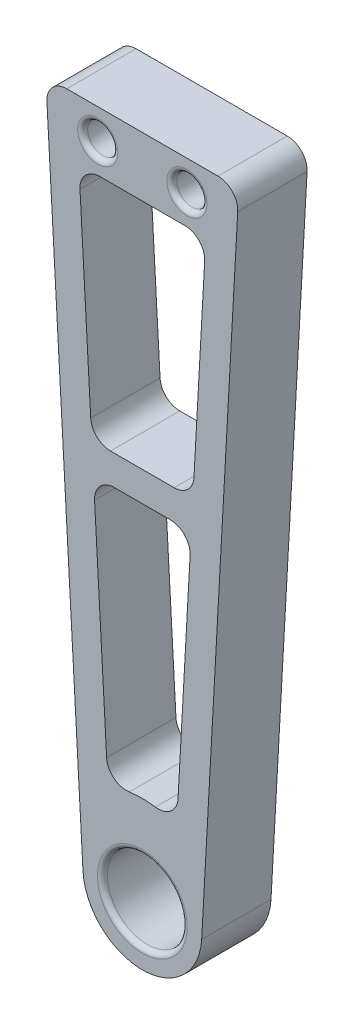
ISO-10303-21;
HEADER;
FILE_DESCRIPTION(('STEP AP214'),'2;1');
FILE_NAME('part.step','',(''),(''),'','','');
FILE_SCHEMA(('AUTOMOTIVE_DESIGN { 1 0 10303 214 1 1 1 1 }'));
ENDSEC;
DATA;
#1=APPLICATION_CONTEXT('core data for automotive mechanical design processes');
#2=APPLICATION_PROTOCOL_DEFINITION('international standard','automotive_design',2000,#1);
#3=PRODUCT_CONTEXT('',#1,'mechanical');
#4=PRODUCT('Part','Part','',(#3));
#5=PRODUCT_RELATED_PRODUCT_CATEGORY('part','',(#4));
#6=PRODUCT_DEFINITION_FORMATION('','',#4);
#7=PRODUCT_DEFINITION_CONTEXT('part definition',#1,'design');
#8=PRODUCT_DEFINITION('design','',#6,#7);
#9=PRODUCT_DEFINITION_SHAPE('','',#8);
#10=(LENGTH_UNIT() NAMED_UNIT(*) SI_UNIT(.MILLI.,.METRE.));
#11=(NAMED_UNIT(*) PLANE_ANGLE_UNIT() SI_UNIT($,.RADIAN.));
#12=(NAMED_UNIT(*) SI_UNIT($,.STERADIAN.) SOLID_ANGLE_UNIT());
#13=UNCERTAINTY_MEASURE_WITH_UNIT(LENGTH_MEASURE(1.E-05),#10,'distance_accuracy_value','');
#14=(GEOMETRIC_REPRESENTATION_CONTEXT(3) GLOBAL_UNCERTAINTY_ASSIGNED_CONTEXT((#13)) GLOBAL_UNIT_ASSIGNED_CONTEXT((#10,
#11,#12)) REPRESENTATION_CONTEXT('',''));
#15=CARTESIAN_POINT('',(0.,0.,0.));
#16=DIRECTION('',(0.,0.,1.));
#17=DIRECTION('',(1.,0.,0.));
#18=AXIS2_PLACEMENT_3D('',#15,#16,#17);
#19=CARTESIAN_POINT('',(7.98764478027175,-0.444444444444444,7.));
#20=DIRECTION('',(0.998455597533968,-0.0555555555555555,0.));
#21=DIRECTION('',(0.0555555555555555,0.998455597533968,0.));
#22=AXIS2_PLACEMENT_3D('',#19,#20,#21);
#23=PLANE('',#22);
#24=DIRECTION('',(-0.0555555555555555,-0.998455597533968,0.));
#25=VECTOR('',#24,1.);
#26=CARTESIAN_POINT('',(7.98764478027175,-0.444444444444444,0.));
#27=LINE('',#26,#25);
#28=CARTESIAN_POINT('',(6.29384167167906,-30.885813952551,0.));
#29=VERTEX_POINT('',#28);
#30=CARTESIAN_POINT('',(5.21106422918038,-50.3457075227848,0.));
#31=VERTEX_POINT('',#30);
#32=EDGE_CURVE('E519',#29,#31,#27,.T.);
#33=ORIENTED_EDGE('',*,*,#32,.T.);
#34=DIRECTION('',(0.,0.,1.));
#35=VECTOR('',#34,1.);
#36=CARTESIAN_POINT('',(5.21106422918038,-50.3457075227848,7.));
#37=LINE('',#36,#35);
#38=CARTESIAN_POINT('',(5.21106422918038,-50.3457075227848,7.));
#39=VERTEX_POINT('',#38);
#40=EDGE_CURVE('E260',#31,#39,#37,.T.);
#41=ORIENTED_EDGE('',*,*,#40,.T.);
#42=DIRECTION('',(-0.0555555555555555,-0.998455597533968,0.));
#43=VECTOR('',#42,1.);
#44=CARTESIAN_POINT('',(7.98764478027175,-0.444444444444444,7.));
#45=LINE('',#44,#43);
#46=CARTESIAN_POINT('',(6.29384167167906,-30.885813952551,7.));
#47=VERTEX_POINT('',#46);
#48=EDGE_CURVE('E456',#47,#39,#45,.T.);
#49=ORIENTED_EDGE('',*,*,#48,.F.);
#50=DIRECTION('',(0.,0.,1.));
#51=VECTOR('',#50,1.);
#52=CARTESIAN_POINT('',(6.29384167167906,-30.885813952551,7.));
#53=LINE('',#52,#51);
#54=EDGE_CURVE('E257',#47,#29,#53,.F.);
#55=ORIENTED_EDGE('',*,*,#54,.T.);
#56=EDGE_LOOP('',(#33,#41,#49,#55));
#57=FACE_BOUND('',#56,.T.);
#58=ADVANCED_FACE('F44',(#57),#23,.F.);
#59=CARTESIAN_POINT('',(-7.98764478027175,-0.444444444444445,7.));
#60=DIRECTION('',(0.998455597533968,0.0555555555555557,0.));
#61=DIRECTION('',(-0.0555555555555557,0.998455597533968,0.));
#62=AXIS2_PLACEMENT_3D('',#59,#60,#61);
#63=PLANE('',#62);
#64=DIRECTION('',(0.0555555555555557,-0.998455597533968,0.));
#65=VECTOR('',#64,1.);
#66=CARTESIAN_POINT('',(-7.98764478027175,-0.444444444444445,7.));
#67=LINE('',#66,#65);
#68=CARTESIAN_POINT('',(-6.29384167167905,-30.885813952551,7.));
#69=VERTEX_POINT('',#68);
#70=CARTESIAN_POINT('',(-5.21106422918037,-50.3457075227848,7.));
#71=VERTEX_POINT('',#70);
#72=EDGE_CURVE('E236',#69,#71,#67,.T.);
#73=ORIENTED_EDGE('',*,*,#72,.T.);
#74=DIRECTION('',(0.,0.,1.));
#75=VECTOR('',#74,1.);
#76=CARTESIAN_POINT('',(-5.21106422918037,-50.3457075227848,0.));
#77=LINE('',#76,#75);
#78=CARTESIAN_POINT('',(-5.21106422918037,-50.3457075227848,0.));
#79=VERTEX_POINT('',#78);
#80=EDGE_CURVE('E275',#71,#79,#77,.F.);
#81=ORIENTED_EDGE('',*,*,#80,.T.);
#82=DIRECTION('',(0.0555555555555557,-0.998455597533968,0.));
#83=VECTOR('',#82,1.);
#84=CARTESIAN_POINT('',(-7.98764478027175,-0.444444444444445,0.));
#85=LINE('',#84,#83);
#86=CARTESIAN_POINT('',(-6.29384167167905,-30.885813952551,0.));
#87=VERTEX_POINT('',#86);
#88=EDGE_CURVE('E210',#87,#79,#85,.T.);
#89=ORIENTED_EDGE('',*,*,#88,.F.);
#90=DIRECTION('',(0.,0.,1.));
#91=VECTOR('',#90,1.);
#92=CARTESIAN_POINT('',(-6.29384167167905,-30.885813952551,7.));
#93=LINE('',#92,#91);
#94=EDGE_CURVE('E271',#87,#69,#93,.T.);
#95=ORIENTED_EDGE('',*,*,#94,.T.);
#96=EDGE_LOOP('',(#73,#81,#89,#95));
#97=FACE_BOUND('',#96,.T.);
#98=ADVANCED_FACE('F428',(#97),#63,.T.);
#99=CARTESIAN_POINT('',(4.82157381032812,-57.3457075227848,7.));
#100=VERTEX_POINT('',#99);
#101=CARTESIAN_POINT('',(3.6039474120521,-79.2291335979336,7.));
#102=VERTEX_POINT('',#101);
#103=EDGE_CURVE('E448',#100,#102,#45,.T.);
#104=ORIENTED_EDGE('',*,*,#103,.F.);
#105=DIRECTION('',(0.,0.,1.));
#106=VECTOR('',#105,1.);
#107=CARTESIAN_POINT('',(4.82157381032812,-57.3457075227848,7.));
#108=LINE('',#107,#106);
#109=CARTESIAN_POINT('',(4.82157381032812,-57.3457075227848,0.));
#110=VERTEX_POINT('',#109);
#111=EDGE_CURVE('E246',#100,#110,#108,.F.);
#112=ORIENTED_EDGE('',*,*,#111,.T.);
#113=CARTESIAN_POINT('',(3.6039474120521,-79.2291335979336,0.));
#114=VERTEX_POINT('',#113);
#115=EDGE_CURVE('E469',#110,#114,#27,.T.);
#116=ORIENTED_EDGE('',*,*,#115,.T.);
#117=DIRECTION('',(0.,0.,1.));
#118=VECTOR('',#117,1.);
#119=CARTESIAN_POINT('',(3.6039474120521,-79.2291335979336,7.));
#120=LINE('',#119,#118);
#121=EDGE_CURVE('E243',#114,#102,#120,.T.);
#122=ORIENTED_EDGE('',*,*,#121,.T.);
#123=EDGE_LOOP('',(#104,#112,#116,#122));
#124=FACE_BOUND('',#123,.T.);
#125=ADVANCED_FACE('F431',(#124),#23,.F.);
#126=CARTESIAN_POINT('',(-4.82157381032811,-57.3457075227848,0.));
#127=VERTEX_POINT('',#126);
#128=CARTESIAN_POINT('',(-3.60394741205208,-79.2291335979336,0.));
#129=VERTEX_POINT('',#128);
#130=EDGE_CURVE('E525',#127,#129,#85,.T.);
#131=ORIENTED_EDGE('',*,*,#130,.F.);
#132=DIRECTION('',(0.,0.,1.));
#133=VECTOR('',#132,1.);
#134=CARTESIAN_POINT('',(-4.82157381032811,-57.3457075227848,7.));
#135=LINE('',#134,#133);
#136=CARTESIAN_POINT('',(-4.82157381032811,-57.3457075227848,7.));
#137=VERTEX_POINT('',#136);
#138=EDGE_CURVE('E253',#127,#137,#135,.T.);
#139=ORIENTED_EDGE('',*,*,#138,.T.);
#140=CARTESIAN_POINT('',(-3.60394741205208,-79.2291335979336,7.));
#141=VERTEX_POINT('',#140);
#142=EDGE_CURVE('E508',#137,#141,#67,.T.);
#143=ORIENTED_EDGE('',*,*,#142,.T.);
#144=DIRECTION('',(0.,0.,-1.));
#145=VECTOR('',#144,1.);
#146=CARTESIAN_POINT('',(-3.60394741205208,-79.2291335979336,7.));
#147=LINE('',#146,#145);
#148=EDGE_CURVE('E249',#141,#129,#147,.T.);
#149=ORIENTED_EDGE('',*,*,#148,.T.);
#150=EDGE_LOOP('',(#131,#139,#143,#149));
#151=FACE_BOUND('',#150,.T.);
#152=ADVANCED_FACE('F436',(#151),#63,.T.);
#153=CARTESIAN_POINT('',(0.,-90.,7.));
#154=DIRECTION('',(0.,0.,-1.));
#155=DIRECTION('',(-1.,0.,0.));
#156=AXIS2_PLACEMENT_3D('',#153,#154,#155);
#157=CYLINDRICAL_SURFACE('',#156,9.00000000000001);
#158=CARTESIAN_POINT('',(0.,-90.,0.));
#159=DIRECTION('',(0.,0.,1.));
#160=DIRECTION('',(1.,0.,0.));
#161=AXIS2_PLACEMENT_3D('',#158,#159,#160);
#162=CIRCLE('',#161,9.00000000000001);
#163=CARTESIAN_POINT('',(1.31484781389614,-81.0965638528547,0.));
#164=VERTEX_POINT('',#163);
#165=CARTESIAN_POINT('',(-1.31484781389612,-81.0965638528547,0.));
#166=VERTEX_POINT('',#165);
#167=EDGE_CURVE('E522',#164,#166,#162,.T.);
#168=ORIENTED_EDGE('',*,*,#167,.T.);
#169=DIRECTION('',(0.,0.,-1.));
#170=VECTOR('',#169,1.);
#171=CARTESIAN_POINT('',(-1.31484781389612,-81.0965638528547,7.));
#172=LINE('',#171,#170);
#173=CARTESIAN_POINT('',(-1.31484781389612,-81.0965638528547,7.));
#174=VERTEX_POINT('',#173);
#175=EDGE_CURVE('E311',#166,#174,#172,.F.);
#176=ORIENTED_EDGE('',*,*,#175,.T.);
#177=CARTESIAN_POINT('',(0.,-90.,7.));
#178=DIRECTION('',(0.,0.,1.));
#179=DIRECTION('',(1.,0.,0.));
#180=AXIS2_PLACEMENT_3D('',#177,#178,#179);
#181=CIRCLE('',#180,9.00000000000001);
#182=CARTESIAN_POINT('',(1.31484781389614,-81.0965638528547,7.));
#183=VERTEX_POINT('',#182);
#184=EDGE_CURVE('E504',#183,#174,#181,.T.);
#185=ORIENTED_EDGE('',*,*,#184,.F.);
#186=DIRECTION('',(0.,0.,-1.));
#187=VECTOR('',#186,1.);
#188=CARTESIAN_POINT('',(1.31484781389614,-81.0965638528547,7.));
#189=LINE('',#188,#187);
#190=EDGE_CURVE('E307',#183,#164,#189,.T.);
#191=ORIENTED_EDGE('',*,*,#190,.T.);
#192=EDGE_LOOP('',(#168,#176,#185,#191));
#193=FACE_BOUND('',#192,.T.);
#194=ADVANCED_FACE('F444',(#193),#157,.T.);
#195=CARTESIAN_POINT('',(-10.9830115728737,-0.611111111111113,7.));
#196=DIRECTION('',(0.998455597533968,0.0555555555555557,0.));
#197=DIRECTION('',(-0.0555555555555557,0.998455597533968,0.));
#198=AXIS2_PLACEMENT_3D('',#195,#196,#197);
#199=PLANE('',#198);
#200=DIRECTION('',(0.0555555555555557,-0.998455597533968,0.));
#201=VECTOR('',#200,1.);
#202=CARTESIAN_POINT('',(-10.9830115728737,-0.611111111111113,7.));
#203=LINE('',#202,#201);
#204=CARTESIAN_POINT('',(-9.632330976127,-24.885813952551,7.));
#205=VERTEX_POINT('',#204);
#206=CARTESIAN_POINT('',(-5.9907335852038,-90.3333333333333,7.));
#207=VERTEX_POINT('',#206);
#208=EDGE_CURVE('E196',#205,#207,#203,.T.);
#209=ORIENTED_EDGE('',*,*,#208,.F.);
#210=DIRECTION('',(0.,0.,-1.));
#211=VECTOR('',#210,1.);
#212=CARTESIAN_POINT('',(-9.632330976127,-24.885813952551,0.));
#213=LINE('',#212,#211);
#214=CARTESIAN_POINT('',(-9.632330976127,-24.885813952551,0.));
#215=VERTEX_POINT('',#214);
#216=EDGE_CURVE('E298',#205,#215,#213,.T.);
#217=ORIENTED_EDGE('',*,*,#216,.T.);
#218=DIRECTION('',(0.0555555555555557,-0.998455597533968,0.));
#219=VECTOR('',#218,1.);
#220=CARTESIAN_POINT('',(-10.9830115728737,-0.611111111111113,0.));
#221=LINE('',#220,#219);
#222=CARTESIAN_POINT('',(-5.9907335852038,-90.3333333333333,0.));
#223=VERTEX_POINT('',#222);
#224=EDGE_CURVE('E224',#215,#223,#221,.T.);
#225=ORIENTED_EDGE('',*,*,#224,.T.);
#226=DIRECTION('',(0.,0.,-1.));
#227=VECTOR('',#226,1.);
#228=CARTESIAN_POINT('',(-5.9907335852038,-90.3333333333333,7.));
#229=LINE('',#228,#227);
#230=EDGE_CURVE('E216',#207,#223,#229,.T.);
#231=ORIENTED_EDGE('',*,*,#230,.F.);
#232=EDGE_LOOP('',(#209,#217,#225,#231));
#233=FACE_BOUND('',#232,.T.);
#234=ADVANCED_FACE('F222',(#233),#199,.F.);
#235=CARTESIAN_POINT('',(0.,-90.,7.));
#236=DIRECTION('',(0.,0.,-1.));
#237=DIRECTION('',(-1.,0.,0.));
#238=AXIS2_PLACEMENT_3D('',#235,#236,#237);
#239=CYLINDRICAL_SURFACE('',#238,6.);
#240=CARTESIAN_POINT('',(0.,-90.,0.));
#241=DIRECTION('',(0.,0.,1.));
#242=DIRECTION('',(1.,0.,0.));
#243=AXIS2_PLACEMENT_3D('',#240,#241,#242);
#244=CIRCLE('',#243,6.);
#245=CARTESIAN_POINT('',(5.99073358520382,-90.3333333333333,0.));
#246=VERTEX_POINT('',#245);
#247=EDGE_CURVE('E513',#223,#246,#244,.T.);
#248=ORIENTED_EDGE('',*,*,#247,.T.);
#249=DIRECTION('',(0.,0.,-1.));
#250=VECTOR('',#249,1.);
#251=CARTESIAN_POINT('',(5.99073358520382,-90.3333333333333,7.));
#252=LINE('',#251,#250);
#253=CARTESIAN_POINT('',(5.99073358520382,-90.3333333333333,7.));
#254=VERTEX_POINT('',#253);
#255=EDGE_CURVE('E218',#254,#246,#252,.T.);
#256=ORIENTED_EDGE('',*,*,#255,.F.);
#257=CARTESIAN_POINT('',(0.,-90.,7.));
#258=DIRECTION('',(0.,0.,1.));
#259=DIRECTION('',(1.,0.,0.));
#260=AXIS2_PLACEMENT_3D('',#257,#258,#259);
#261=CIRCLE('',#260,6.);
#262=EDGE_CURVE('E200',#207,#254,#261,.T.);
#263=ORIENTED_EDGE('',*,*,#262,.F.);
#264=ORIENTED_EDGE('',*,*,#230,.T.);
#265=EDGE_LOOP('',(#248,#256,#263,#264));
#266=FACE_BOUND('',#265,.T.);
#267=ADVANCED_FACE('F215',(#266),#239,.T.);
#268=CARTESIAN_POINT('',(10.9830115728737,-0.61111111111111,7.));
#269=DIRECTION('',(0.998455597533968,-0.0555555555555555,0.));
#270=DIRECTION('',(0.0555555555555555,0.998455597533968,0.));
#271=AXIS2_PLACEMENT_3D('',#268,#269,#270);
#272=PLANE('',#271);
#273=DIRECTION('',(-0.0555555555555555,-0.998455597533968,0.));
#274=VECTOR('',#273,1.);
#275=CARTESIAN_POINT('',(10.9830115728737,-0.61111111111111,0.));
#276=LINE('',#275,#274);
#277=CARTESIAN_POINT('',(9.632330976127,-24.885813952551,0.));
#278=VERTEX_POINT('',#277);
#279=EDGE_CURVE('E516',#278,#246,#276,.T.);
#280=ORIENTED_EDGE('',*,*,#279,.F.);
#281=DIRECTION('',(0.,0.,-1.));
#282=VECTOR('',#281,1.);
#283=CARTESIAN_POINT('',(9.632330976127,-24.885813952551,7.));
#284=LINE('',#283,#282);
#285=CARTESIAN_POINT('',(9.632330976127,-24.885813952551,7.));
#286=VERTEX_POINT('',#285);
#287=EDGE_CURVE('E291',#278,#286,#284,.F.);
#288=ORIENTED_EDGE('',*,*,#287,.T.);
#289=DIRECTION('',(-0.0555555555555555,-0.998455597533968,0.));
#290=VECTOR('',#289,1.);
#291=CARTESIAN_POINT('',(10.9830115728737,-0.61111111111111,7.));
#292=LINE('',#291,#290);
#293=EDGE_CURVE('E220',#286,#254,#292,.T.);
#294=ORIENTED_EDGE('',*,*,#293,.T.);
#295=ORIENTED_EDGE('',*,*,#255,.T.);
#296=EDGE_LOOP('',(#280,#288,#294,#295));
#297=FACE_BOUND('',#296,.T.);
#298=ADVANCED_FACE('F628',(#297),#272,.T.);
#299=CARTESIAN_POINT('',(0.,-90.,7.));
#300=DIRECTION('',(0.,0.,-1.));
#301=DIRECTION('',(-1.,0.,0.));
#302=AXIS2_PLACEMENT_3D('',#299,#300,#301);
#303=CYLINDRICAL_SURFACE('',#302,4.025);
#304=CARTESIAN_POINT('',(0.,-90.,0.5));
#305=DIRECTION('',(0.,0.,1.));
#306=DIRECTION('',(1.,0.,0.));
#307=AXIS2_PLACEMENT_3D('',#304,#305,#306);
#308=CIRCLE('',#307,4.025);
#309=CARTESIAN_POINT('',(4.02500000000001,-90.,0.5));
#310=VERTEX_POINT('',#309);
#311=EDGE_CURVE('E376',#310,#310,#308,.F.);
#312=ORIENTED_EDGE('',*,*,#311,.T.);
#313=EDGE_LOOP('',(#312));
#314=FACE_BOUND('',#313,.T.);
#315=CARTESIAN_POINT('',(0.,-90.,6.5));
#316=DIRECTION('',(0.,0.,1.));
#317=DIRECTION('',(1.,0.,0.));
#318=AXIS2_PLACEMENT_3D('',#315,#316,#317);
#319=CIRCLE('',#318,4.025);
#320=CARTESIAN_POINT('',(4.02500000000001,-90.,6.5));
#321=VERTEX_POINT('',#320);
#322=EDGE_CURVE('E372',#321,#321,#319,.T.);
#323=ORIENTED_EDGE('',*,*,#322,.T.);
#324=EDGE_LOOP('',(#323));
#325=FACE_BOUND('',#324,.T.);
#326=ADVANCED_FACE('F621',(#314,#325),#303,.F.);
#327=CARTESIAN_POINT('',(0.,0.,7.));
#328=DIRECTION('',(0.,0.,1.));
#329=DIRECTION('',(1.,0.,0.));
#330=AXIS2_PLACEMENT_3D('',#327,#328,#329);
#331=PLANE('',#330);
#332=CARTESIAN_POINT('',(4.5,-25.7747028414399,7.));
#333=DIRECTION('',(0.,0.,1.));
#334=DIRECTION('',(1.,0.,0.));
#335=AXIS2_PLACEMENT_3D('',#332,#333,#334);
#336=CIRCLE('',#335,2.025);
#337=CARTESIAN_POINT('',(6.525,-25.7747028414399,7.));
#338=VERTEX_POINT('',#337);
#339=EDGE_CURVE('E11',#338,#338,#336,.F.);
#340=ORIENTED_EDGE('',*,*,#339,.T.);
#341=EDGE_LOOP('',(#340));
#342=FACE_BOUND('',#341,.T.);
#343=CARTESIAN_POINT('',(-4.5,-25.7747028414399,7.));
#344=DIRECTION('',(0.,0.,1.));
#345=DIRECTION('',(1.,0.,0.));
#346=AXIS2_PLACEMENT_3D('',#343,#344,#345);
#347=CIRCLE('',#346,2.025);
#348=CARTESIAN_POINT('',(-2.475,-25.7747028414399,7.));
#349=VERTEX_POINT('',#348);
#350=EDGE_CURVE('E53',#349,#349,#347,.F.);
#351=ORIENTED_EDGE('',*,*,#350,.T.);
#352=EDGE_LOOP('',(#351));
#353=FACE_BOUND('',#352,.T.);
#354=CARTESIAN_POINT('',(0.,-90.,7.));
#355=DIRECTION('',(0.,0.,1.));
#356=DIRECTION('',(1.,0.,0.));
#357=AXIS2_PLACEMENT_3D('',#354,#355,#356);
#358=CIRCLE('',#357,4.525);
#359=CARTESIAN_POINT('',(4.52500000000001,-90.,7.));
#360=VERTEX_POINT('',#359);
#361=EDGE_CURVE('E396',#360,#360,#358,.F.);
#362=ORIENTED_EDGE('',*,*,#361,.T.);
#363=EDGE_LOOP('',(#362));
#364=FACE_BOUND('',#363,.T.);
#365=ORIENTED_EDGE('',*,*,#142,.F.);
#366=CARTESIAN_POINT('',(-2.82466261526017,-57.2345964116737,7.));
#367=DIRECTION('',(0.,0.,1.));
#368=DIRECTION('',(1.,0.,0.));
#369=AXIS2_PLACEMENT_3D('',#366,#367,#368);
#370=CIRCLE('',#369,2.);
#371=CARTESIAN_POINT('',(-2.82466261526017,-55.2345964116737,7.));
#372=VERTEX_POINT('',#371);
#373=EDGE_CURVE('E320',#137,#372,#370,.F.);
#374=ORIENTED_EDGE('',*,*,#373,.T.);
#375=DIRECTION('',(1.,0.,0.));
#376=VECTOR('',#375,1.);
#377=CARTESIAN_POINT('',(-4.93903917474386,-55.2345964116737,7.));
#378=LINE('',#377,#376);
#379=CARTESIAN_POINT('',(2.82466261526018,-55.2345964116737,7.));
#380=VERTEX_POINT('',#379);
#381=EDGE_CURVE('E543',#372,#380,#378,.T.);
#382=ORIENTED_EDGE('',*,*,#381,.T.);
#383=CARTESIAN_POINT('',(2.82466261526019,-57.2345964116737,7.));
#384=DIRECTION('',(0.,0.,1.));
#385=DIRECTION('',(1.,0.,0.));
#386=AXIS2_PLACEMENT_3D('',#383,#384,#385);
#387=CIRCLE('',#386,2.);
#388=EDGE_CURVE('E314',#380,#100,#387,.F.);
#389=ORIENTED_EDGE('',*,*,#388,.T.);
#390=ORIENTED_EDGE('',*,*,#103,.T.);
#391=CARTESIAN_POINT('',(1.60703621698416,-79.1180224868225,7.));
#392=DIRECTION('',(0.,0.,1.));
#393=DIRECTION('',(1.,0.,0.));
#394=AXIS2_PLACEMENT_3D('',#391,#392,#393);
#395=CIRCLE('',#394,2.);
#396=EDGE_CURVE('E357',#102,#183,#395,.F.);
#397=ORIENTED_EDGE('',*,*,#396,.T.);
#398=ORIENTED_EDGE('',*,*,#184,.T.);
#399=CARTESIAN_POINT('',(-1.60703621698414,-79.1180224868225,7.));
#400=DIRECTION('',(0.,0.,1.));
#401=DIRECTION('',(1.,0.,0.));
#402=AXIS2_PLACEMENT_3D('',#399,#400,#401);
#403=CIRCLE('',#402,2.);
#404=EDGE_CURVE('E351',#174,#141,#403,.F.);
#405=ORIENTED_EDGE('',*,*,#404,.T.);
#406=EDGE_LOOP('',(#365,#374,#382,#389,#390,#397,#398,#405));
#407=FACE_BOUND('',#406,.T.);
#408=ORIENTED_EDGE('',*,*,#293,.F.);
#409=CARTESIAN_POINT('',(7.63541978105907,-24.7747028414399,7.));
#410=DIRECTION('',(0.,0.,1.));
#411=DIRECTION('',(1.,0.,0.));
#412=AXIS2_PLACEMENT_3D('',#409,#410,#411);
#413=CIRCLE('',#412,2.);
#414=CARTESIAN_POINT('',(7.63541978105906,-22.7747028414399,7.));
#415=VERTEX_POINT('',#414);
#416=EDGE_CURVE('E295',#286,#415,#413,.T.);
#417=ORIENTED_EDGE('',*,*,#416,.T.);
#418=DIRECTION('',(-1.,0.,0.));
#419=VECTOR('',#418,1.);
#420=CARTESIAN_POINT('',(-6.7451559665396,-22.7747028414399,7.));
#421=LINE('',#420,#419);
#422=CARTESIAN_POINT('',(-7.63541978105906,-22.7747028414399,7.));
#423=VERTEX_POINT('',#422);
#424=EDGE_CURVE('E481',#415,#423,#421,.T.);
#425=ORIENTED_EDGE('',*,*,#424,.T.);
#426=CARTESIAN_POINT('',(-7.63541978105906,-24.7747028414399,7.));
#427=DIRECTION('',(0.,0.,1.));
#428=DIRECTION('',(1.,0.,0.));
#429=AXIS2_PLACEMENT_3D('',#426,#427,#428);
#430=CIRCLE('',#429,2.);
#431=EDGE_CURVE('E204',#423,#205,#430,.T.);
#432=ORIENTED_EDGE('',*,*,#431,.T.);
#433=ORIENTED_EDGE('',*,*,#208,.T.);
#434=ORIENTED_EDGE('',*,*,#262,.T.);
#435=EDGE_LOOP('',(#408,#417,#425,#432,#433,#434));
#436=FACE_BOUND('',#435,.T.);
#437=ORIENTED_EDGE('',*,*,#72,.F.);
#438=CARTESIAN_POINT('',(-4.29693047661111,-30.7747028414399,7.));
#439=DIRECTION('',(0.,0.,1.));
#440=DIRECTION('',(1.,0.,0.));
#441=AXIS2_PLACEMENT_3D('',#438,#439,#440);
#442=CIRCLE('',#441,2.);
#443=CARTESIAN_POINT('',(-4.29693047661111,-28.7747028414399,7.));
#444=VERTEX_POINT('',#443);
#445=EDGE_CURVE('E68',#69,#444,#442,.F.);
#446=ORIENTED_EDGE('',*,*,#445,.T.);
#447=DIRECTION('',(1.,0.,0.));
#448=VECTOR('',#447,1.);
#449=CARTESIAN_POINT('',(-6.41130703609481,-28.7747028414399,7.));
#450=LINE('',#449,#448);
#451=CARTESIAN_POINT('',(4.29693047661112,-28.7747028414399,7.));
#452=VERTEX_POINT('',#451);
#453=EDGE_CURVE('E476',#444,#452,#450,.T.);
#454=ORIENTED_EDGE('',*,*,#453,.T.);
#455=CARTESIAN_POINT('',(4.29693047661112,-30.7747028414399,7.));
#456=DIRECTION('',(0.,0.,1.));
#457=DIRECTION('',(1.,0.,0.));
#458=AXIS2_PLACEMENT_3D('',#455,#456,#457);
#459=CIRCLE('',#458,2.);
#460=EDGE_CURVE('E60',#452,#47,#459,.F.);
#461=ORIENTED_EDGE('',*,*,#460,.T.);
#462=ORIENTED_EDGE('',*,*,#48,.T.);
#463=CARTESIAN_POINT('',(3.21415303411245,-50.2345964116737,7.));
#464=DIRECTION('',(0.,0.,1.));
#465=DIRECTION('',(1.,0.,0.));
#466=AXIS2_PLACEMENT_3D('',#463,#464,#465);
#467=CIRCLE('',#466,2.);
#468=CARTESIAN_POINT('',(3.21415303411245,-52.2345964116737,7.));
#469=VERTEX_POINT('',#468);
#470=EDGE_CURVE('E326',#39,#469,#467,.F.);
#471=ORIENTED_EDGE('',*,*,#470,.T.);
#472=DIRECTION('',(-1.,0.,0.));
#473=VECTOR('',#472,1.);
#474=CARTESIAN_POINT('',(-5.10596363996626,-52.2345964116737,7.));
#475=LINE('',#474,#473);
#476=CARTESIAN_POINT('',(-3.21415303411243,-52.2345964116737,7.));
#477=VERTEX_POINT('',#476);
#478=EDGE_CURVE('E485',#469,#477,#475,.T.);
#479=ORIENTED_EDGE('',*,*,#478,.T.);
#480=CARTESIAN_POINT('',(-3.21415303411243,-50.2345964116737,7.));
#481=DIRECTION('',(0.,0.,1.));
#482=DIRECTION('',(1.,0.,0.));
#483=AXIS2_PLACEMENT_3D('',#480,#481,#482);
#484=CIRCLE('',#483,2.);
#485=EDGE_CURVE('E332',#477,#71,#484,.F.);
#486=ORIENTED_EDGE('',*,*,#485,.T.);
#487=EDGE_LOOP('',(#437,#446,#454,#461,#462,#471,#479,#486));
#488=FACE_BOUND('',#487,.T.);
#489=ADVANCED_FACE('F199',(#342,#353,#364,#407,#436,#488),#331,.T.);
#490=CARTESIAN_POINT('',(0.,0.,0.));
#491=DIRECTION('',(0.,0.,1.));
#492=DIRECTION('',(1.,0.,0.));
#493=AXIS2_PLACEMENT_3D('',#490,#491,#492);
#494=PLANE('',#493);
#495=CARTESIAN_POINT('',(0.,-90.,0.));
#496=DIRECTION('',(0.,0.,1.));
#497=DIRECTION('',(1.,0.,0.));
#498=AXIS2_PLACEMENT_3D('',#495,#496,#497);
#499=CIRCLE('',#498,4.525);
#500=CARTESIAN_POINT('',(4.52500000000001,-90.,0.));
#501=VERTEX_POINT('',#500);
#502=EDGE_CURVE('E368',#501,#501,#499,.T.);
#503=ORIENTED_EDGE('',*,*,#502,.T.);
#504=EDGE_LOOP('',(#503));
#505=FACE_BOUND('',#504,.T.);
#506=CARTESIAN_POINT('',(-4.5,-25.7747028414399,0.));
#507=DIRECTION('',(0.,0.,1.));
#508=DIRECTION('',(1.,0.,0.));
#509=AXIS2_PLACEMENT_3D('',#506,#507,#508);
#510=CIRCLE('',#509,2.025);
#511=CARTESIAN_POINT('',(-2.475,-25.7747028414399,0.));
#512=VERTEX_POINT('',#511);
#513=EDGE_CURVE('E364',#512,#512,#510,.T.);
#514=ORIENTED_EDGE('',*,*,#513,.T.);
#515=EDGE_LOOP('',(#514));
#516=FACE_BOUND('',#515,.T.);
#517=CARTESIAN_POINT('',(4.5,-25.7747028414399,0.));
#518=DIRECTION('',(0.,0.,1.));
#519=DIRECTION('',(1.,0.,0.));
#520=AXIS2_PLACEMENT_3D('',#517,#518,#519);
#521=CIRCLE('',#520,2.025);
#522=CARTESIAN_POINT('',(6.525,-25.7747028414399,0.));
#523=VERTEX_POINT('',#522);
#524=EDGE_CURVE('E360',#523,#523,#521,.T.);
#525=ORIENTED_EDGE('',*,*,#524,.T.);
#526=EDGE_LOOP('',(#525));
#527=FACE_BOUND('',#526,.T.);
#528=DIRECTION('',(-1.,0.,0.));
#529=VECTOR('',#528,1.);
#530=CARTESIAN_POINT('',(-6.41130703609481,-28.7747028414399,0.));
#531=LINE('',#530,#529);
#532=CARTESIAN_POINT('',(4.29693047661112,-28.7747028414399,0.));
#533=VERTEX_POINT('',#532);
#534=CARTESIAN_POINT('',(-4.29693047661111,-28.7747028414399,0.));
#535=VERTEX_POINT('',#534);
#536=EDGE_CURVE('E490',#533,#535,#531,.T.);
#537=ORIENTED_EDGE('',*,*,#536,.T.);
#538=CARTESIAN_POINT('',(-4.29693047661111,-30.7747028414399,0.));
#539=DIRECTION('',(0.,0.,1.));
#540=DIRECTION('',(1.,0.,0.));
#541=AXIS2_PLACEMENT_3D('',#538,#539,#540);
#542=CIRCLE('',#541,2.);
#543=EDGE_CURVE('E340',#535,#87,#542,.T.);
#544=ORIENTED_EDGE('',*,*,#543,.T.);
#545=ORIENTED_EDGE('',*,*,#88,.T.);
#546=CARTESIAN_POINT('',(-3.21415303411243,-50.2345964116737,0.));
#547=DIRECTION('',(0.,0.,1.));
#548=DIRECTION('',(1.,0.,0.));
#549=AXIS2_PLACEMENT_3D('',#546,#547,#548);
#550=CIRCLE('',#549,2.);
#551=CARTESIAN_POINT('',(-3.21415303411243,-52.2345964116737,0.));
#552=VERTEX_POINT('',#551);
#553=EDGE_CURVE('E335',#79,#552,#550,.T.);
#554=ORIENTED_EDGE('',*,*,#553,.T.);
#555=DIRECTION('',(1.,0.,0.));
#556=VECTOR('',#555,1.);
#557=CARTESIAN_POINT('',(-5.10596363996626,-52.2345964116737,0.));
#558=LINE('',#557,#556);
#559=CARTESIAN_POINT('',(3.21415303411245,-52.2345964116737,0.));
#560=VERTEX_POINT('',#559);
#561=EDGE_CURVE('E477',#552,#560,#558,.T.);
#562=ORIENTED_EDGE('',*,*,#561,.T.);
#563=CARTESIAN_POINT('',(3.21415303411245,-50.2345964116737,0.));
#564=DIRECTION('',(0.,0.,1.));
#565=DIRECTION('',(1.,0.,0.));
#566=AXIS2_PLACEMENT_3D('',#563,#564,#565);
#567=CIRCLE('',#566,2.);
#568=EDGE_CURVE('E329',#560,#31,#567,.T.);
#569=ORIENTED_EDGE('',*,*,#568,.T.);
#570=ORIENTED_EDGE('',*,*,#32,.F.);
#571=CARTESIAN_POINT('',(4.29693047661112,-30.7747028414399,0.));
#572=DIRECTION('',(0.,0.,1.));
#573=DIRECTION('',(1.,0.,0.));
#574=AXIS2_PLACEMENT_3D('',#571,#572,#573);
#575=CIRCLE('',#574,2.);
#576=EDGE_CURVE('E345',#29,#533,#575,.T.);
#577=ORIENTED_EDGE('',*,*,#576,.T.);
#578=EDGE_LOOP('',(#537,#544,#545,#554,#562,#569,#570,#577));
#579=FACE_BOUND('',#578,.T.);
#580=ORIENTED_EDGE('',*,*,#115,.F.);
#581=CARTESIAN_POINT('',(2.82466261526019,-57.2345964116737,0.));
#582=DIRECTION('',(0.,0.,1.));
#583=DIRECTION('',(1.,0.,0.));
#584=AXIS2_PLACEMENT_3D('',#581,#582,#583);
#585=CIRCLE('',#584,2.);
#586=CARTESIAN_POINT('',(2.82466261526018,-55.2345964116737,0.));
#587=VERTEX_POINT('',#586);
#588=EDGE_CURVE('E317',#110,#587,#585,.T.);
#589=ORIENTED_EDGE('',*,*,#588,.T.);
#590=DIRECTION('',(-1.,0.,0.));
#591=VECTOR('',#590,1.);
#592=CARTESIAN_POINT('',(-4.93903917474386,-55.2345964116737,0.));
#593=LINE('',#592,#591);
#594=CARTESIAN_POINT('',(-2.82466261526017,-55.2345964116737,0.));
#595=VERTEX_POINT('',#594);
#596=EDGE_CURVE('E467',#587,#595,#593,.T.);
#597=ORIENTED_EDGE('',*,*,#596,.T.);
#598=CARTESIAN_POINT('',(-2.82466261526017,-57.2345964116737,0.));
#599=DIRECTION('',(0.,0.,1.));
#600=DIRECTION('',(1.,0.,0.));
#601=AXIS2_PLACEMENT_3D('',#598,#599,#600);
#602=CIRCLE('',#601,2.);
#603=EDGE_CURVE('E323',#595,#127,#602,.T.);
#604=ORIENTED_EDGE('',*,*,#603,.T.);
#605=ORIENTED_EDGE('',*,*,#130,.T.);
#606=CARTESIAN_POINT('',(-1.60703621698414,-79.1180224868225,0.));
#607=DIRECTION('',(0.,0.,1.));
#608=DIRECTION('',(1.,0.,0.));
#609=AXIS2_PLACEMENT_3D('',#606,#607,#608);
#610=CIRCLE('',#609,2.);
#611=EDGE_CURVE('E348',#129,#166,#610,.T.);
#612=ORIENTED_EDGE('',*,*,#611,.T.);
#613=ORIENTED_EDGE('',*,*,#167,.F.);
#614=CARTESIAN_POINT('',(1.60703621698416,-79.1180224868225,0.));
#615=DIRECTION('',(0.,0.,1.));
#616=DIRECTION('',(1.,0.,0.));
#617=AXIS2_PLACEMENT_3D('',#614,#615,#616);
#618=CIRCLE('',#617,2.);
#619=EDGE_CURVE('E354',#164,#114,#618,.T.);
#620=ORIENTED_EDGE('',*,*,#619,.T.);
#621=EDGE_LOOP('',(#580,#589,#597,#604,#605,#612,#613,#620));
#622=FACE_BOUND('',#621,.T.);
#623=DIRECTION('',(1.,0.,0.));
#624=VECTOR('',#623,1.);
#625=CARTESIAN_POINT('',(-6.7451559665396,-22.7747028414399,0.));
#626=LINE('',#625,#624);
#627=CARTESIAN_POINT('',(-7.63541978105906,-22.7747028414399,0.));
#628=VERTEX_POINT('',#627);
#629=CARTESIAN_POINT('',(7.63541978105907,-22.7747028414399,0.));
#630=VERTEX_POINT('',#629);
#631=EDGE_CURVE('E494',#628,#630,#626,.T.);
#632=ORIENTED_EDGE('',*,*,#631,.T.);
#633=CARTESIAN_POINT('',(7.63541978105907,-24.7747028414399,0.));
#634=DIRECTION('',(0.,0.,1.));
#635=DIRECTION('',(1.,0.,0.));
#636=AXIS2_PLACEMENT_3D('',#633,#634,#635);
#637=CIRCLE('',#636,2.);
#638=EDGE_CURVE('E288',#630,#278,#637,.F.);
#639=ORIENTED_EDGE('',*,*,#638,.T.);
#640=ORIENTED_EDGE('',*,*,#279,.T.);
#641=ORIENTED_EDGE('',*,*,#247,.F.);
#642=ORIENTED_EDGE('',*,*,#224,.F.);
#643=CARTESIAN_POINT('',(-7.63541978105906,-24.7747028414399,0.));
#644=DIRECTION('',(0.,0.,1.));
#645=DIRECTION('',(1.,0.,0.));
#646=AXIS2_PLACEMENT_3D('',#643,#644,#645);
#647=CIRCLE('',#646,2.);
#648=EDGE_CURVE('E285',#215,#628,#647,.F.);
#649=ORIENTED_EDGE('',*,*,#648,.T.);
#650=EDGE_LOOP('',(#632,#639,#640,#641,#642,#649));
#651=FACE_BOUND('',#650,.T.);
#652=ADVANCED_FACE('F465',(#505,#516,#527,#579,#622,#651),#494,.F.);
#653=CARTESIAN_POINT('',(-6.41130703609481,-28.7747028414399,-14.7644341595531));
#654=DIRECTION('',(0.,-1.,0.));
#655=DIRECTION('',(0.,0.,-1.));
#656=AXIS2_PLACEMENT_3D('',#653,#654,#655);
#657=PLANE('',#656);
#658=ORIENTED_EDGE('',*,*,#453,.F.);
#659=DIRECTION('',(0.,0.,1.));
#660=VECTOR('',#659,1.);
#661=CARTESIAN_POINT('',(-4.29693047661111,-28.7747028414399,0.));
#662=LINE('',#661,#660);
#663=EDGE_CURVE('E304',#444,#535,#662,.F.);
#664=ORIENTED_EDGE('',*,*,#663,.T.);
#665=ORIENTED_EDGE('',*,*,#536,.F.);
#666=DIRECTION('',(0.,0.,1.));
#667=VECTOR('',#666,1.);
#668=CARTESIAN_POINT('',(4.29693047661112,-28.7747028414399,-14.7644341595531));
#669=LINE('',#668,#667);
#670=EDGE_CURVE('E301',#533,#452,#669,.T.);
#671=ORIENTED_EDGE('',*,*,#670,.T.);
#672=EDGE_LOOP('',(#658,#664,#665,#671));
#673=FACE_BOUND('',#672,.T.);
#674=ADVANCED_FACE('F424',(#673),#657,.T.);
#675=CARTESIAN_POINT('',(-6.7451559665396,-22.7747028414399,-14.7644341595531));
#676=DIRECTION('',(0.,1.,0.));
#677=DIRECTION('',(0.,0.,1.));
#678=AXIS2_PLACEMENT_3D('',#675,#676,#677);
#679=PLANE('',#678);
#680=ORIENTED_EDGE('',*,*,#424,.F.);
#681=DIRECTION('',(0.,0.,-1.));
#682=VECTOR('',#681,1.);
#683=CARTESIAN_POINT('',(7.63541978105907,-22.7747028414399,-14.7644341595531));
#684=LINE('',#683,#682);
#685=EDGE_CURVE('E281',#415,#630,#684,.T.);
#686=ORIENTED_EDGE('',*,*,#685,.T.);
#687=ORIENTED_EDGE('',*,*,#631,.F.);
#688=DIRECTION('',(0.,0.,-1.));
#689=VECTOR('',#688,1.);
#690=CARTESIAN_POINT('',(-7.63541978105906,-22.7747028414399,7.));
#691=LINE('',#690,#689);
#692=EDGE_CURVE('E278',#628,#423,#691,.F.);
#693=ORIENTED_EDGE('',*,*,#692,.T.);
#694=EDGE_LOOP('',(#680,#686,#687,#693));
#695=FACE_BOUND('',#694,.T.);
#696=ADVANCED_FACE('F415',(#695),#679,.T.);
#697=CARTESIAN_POINT('',(-4.5,-25.7747028414399,-14.7644341595531));
#698=DIRECTION('',(0.,0.,1.));
#699=DIRECTION('',(1.,0.,0.));
#700=AXIS2_PLACEMENT_3D('',#697,#698,#699);
#701=CYLINDRICAL_SURFACE('',#700,1.525);
#702=CARTESIAN_POINT('',(-4.5,-25.7747028414399,0.5));
#703=DIRECTION('',(0.,0.,1.));
#704=DIRECTION('',(1.,0.,0.));
#705=AXIS2_PLACEMENT_3D('',#702,#703,#704);
#706=CIRCLE('',#705,1.525);
#707=CARTESIAN_POINT('',(-2.975,-25.7747028414399,0.5));
#708=VERTEX_POINT('',#707);
#709=EDGE_CURVE('E384',#708,#708,#706,.F.);
#710=ORIENTED_EDGE('',*,*,#709,.T.);
#711=EDGE_LOOP('',(#710));
#712=FACE_BOUND('',#711,.T.);
#713=CARTESIAN_POINT('',(-4.5,-25.7747028414399,6.5));
#714=DIRECTION('',(0.,0.,1.));
#715=DIRECTION('',(1.,0.,0.));
#716=AXIS2_PLACEMENT_3D('',#713,#714,#715);
#717=CIRCLE('',#716,1.525);
#718=CARTESIAN_POINT('',(-2.975,-25.7747028414399,6.5));
#719=VERTEX_POINT('',#718);
#720=EDGE_CURVE('E380',#719,#719,#717,.T.);
#721=ORIENTED_EDGE('',*,*,#720,.T.);
#722=EDGE_LOOP('',(#721));
#723=FACE_BOUND('',#722,.T.);
#724=ADVANCED_FACE('F412',(#712,#723),#701,.F.);
#725=CARTESIAN_POINT('',(4.5,-25.7747028414399,-14.7644341595531));
#726=DIRECTION('',(0.,0.,1.));
#727=DIRECTION('',(1.,0.,0.));
#728=AXIS2_PLACEMENT_3D('',#725,#726,#727);
#729=CYLINDRICAL_SURFACE('',#728,1.525);
#730=CARTESIAN_POINT('',(4.5,-25.7747028414399,0.5));
#731=DIRECTION('',(0.,0.,1.));
#732=DIRECTION('',(1.,0.,0.));
#733=AXIS2_PLACEMENT_3D('',#730,#731,#732);
#734=CIRCLE('',#733,1.525);
#735=CARTESIAN_POINT('',(6.025,-25.7747028414399,0.5));
#736=VERTEX_POINT('',#735);
#737=EDGE_CURVE('E392',#736,#736,#734,.F.);
#738=ORIENTED_EDGE('',*,*,#737,.T.);
#739=EDGE_LOOP('',(#738));
#740=FACE_BOUND('',#739,.T.);
#741=CARTESIAN_POINT('',(4.5,-25.7747028414399,6.5));
#742=DIRECTION('',(0.,0.,1.));
#743=DIRECTION('',(1.,0.,0.));
#744=AXIS2_PLACEMENT_3D('',#741,#742,#743);
#745=CIRCLE('',#744,1.525);
#746=CARTESIAN_POINT('',(6.025,-25.7747028414399,6.5));
#747=VERTEX_POINT('',#746);
#748=EDGE_CURVE('E388',#747,#747,#745,.T.);
#749=ORIENTED_EDGE('',*,*,#748,.T.);
#750=EDGE_LOOP('',(#749));
#751=FACE_BOUND('',#750,.T.);
#752=ADVANCED_FACE('F414',(#740,#751),#729,.F.);
#753=CARTESIAN_POINT('',(-5.10596363996626,-52.2345964116737,-10.6434702409802));
#754=DIRECTION('',(0.,1.,0.));
#755=DIRECTION('',(0.,0.,1.));
#756=AXIS2_PLACEMENT_3D('',#753,#754,#755);
#757=PLANE('',#756);
#758=ORIENTED_EDGE('',*,*,#478,.F.);
#759=DIRECTION('',(0.,0.,1.));
#760=VECTOR('',#759,1.);
#761=CARTESIAN_POINT('',(3.21415303411245,-52.2345964116737,-10.6434702409802));
#762=LINE('',#761,#760);
#763=EDGE_CURVE('E268',#469,#560,#762,.F.);
#764=ORIENTED_EDGE('',*,*,#763,.T.);
#765=ORIENTED_EDGE('',*,*,#561,.F.);
#766=DIRECTION('',(0.,0.,1.));
#767=VECTOR('',#766,1.);
#768=CARTESIAN_POINT('',(-3.21415303411243,-52.2345964116737,7.));
#769=LINE('',#768,#767);
#770=EDGE_CURVE('E264',#552,#477,#769,.T.);
#771=ORIENTED_EDGE('',*,*,#770,.T.);
#772=EDGE_LOOP('',(#758,#764,#765,#771));
#773=FACE_BOUND('',#772,.T.);
#774=ADVANCED_FACE('F421',(#773),#757,.T.);
#775=CARTESIAN_POINT('',(-4.93903917474386,-55.2345964116737,-10.6434702409802));
#776=DIRECTION('',(0.,-1.,0.));
#777=DIRECTION('',(1.,0.,0.));
#778=AXIS2_PLACEMENT_3D('',#775,#776,#777);
#779=PLANE('',#778);
#780=ORIENTED_EDGE('',*,*,#596,.F.);
#781=DIRECTION('',(0.,0.,1.));
#782=VECTOR('',#781,1.);
#783=CARTESIAN_POINT('',(2.82466261526018,-55.2345964116737,-10.6434702409802));
#784=LINE('',#783,#782);
#785=EDGE_CURVE('E233',#587,#380,#784,.T.);
#786=ORIENTED_EDGE('',*,*,#785,.T.);
#787=ORIENTED_EDGE('',*,*,#381,.F.);
#788=DIRECTION('',(0.,0.,1.));
#789=VECTOR('',#788,1.);
#790=CARTESIAN_POINT('',(-2.82466261526017,-55.2345964116737,0.));
#791=LINE('',#790,#789);
#792=EDGE_CURVE('E227',#372,#595,#791,.F.);
#793=ORIENTED_EDGE('',*,*,#792,.T.);
#794=EDGE_LOOP('',(#780,#786,#787,#793));
#795=FACE_BOUND('',#794,.T.);
#796=ADVANCED_FACE('F471',(#795),#779,.T.);
#797=CARTESIAN_POINT('',(2.82466261526019,-57.2345964116737,-10.6434702409802));
#798=DIRECTION('',(0.,0.,1.));
#799=DIRECTION('',(1.,0.,0.));
#800=AXIS2_PLACEMENT_3D('',#797,#798,#799);
#801=CYLINDRICAL_SURFACE('',#800,2.);
#802=ORIENTED_EDGE('',*,*,#588,.F.);
#803=ORIENTED_EDGE('',*,*,#111,.F.);
#804=ORIENTED_EDGE('',*,*,#388,.F.);
#805=ORIENTED_EDGE('',*,*,#785,.F.);
#806=EDGE_LOOP('',(#802,#803,#804,#805));
#807=FACE_BOUND('',#806,.T.);
#808=ADVANCED_FACE('F460',(#807),#801,.F.);
#809=CARTESIAN_POINT('',(-2.82466261526017,-57.2345964116737,7.));
#810=DIRECTION('',(0.,0.,-1.));
#811=DIRECTION('',(-1.,0.,0.));
#812=AXIS2_PLACEMENT_3D('',#809,#810,#811);
#813=CYLINDRICAL_SURFACE('',#812,2.);
#814=ORIENTED_EDGE('',*,*,#603,.F.);
#815=ORIENTED_EDGE('',*,*,#792,.F.);
#816=ORIENTED_EDGE('',*,*,#373,.F.);
#817=ORIENTED_EDGE('',*,*,#138,.F.);
#818=EDGE_LOOP('',(#814,#815,#816,#817));
#819=FACE_BOUND('',#818,.T.);
#820=ADVANCED_FACE('F542',(#819),#813,.F.);
#821=CARTESIAN_POINT('',(3.21415303411245,-50.2345964116737,7.));
#822=DIRECTION('',(0.,0.,1.));
#823=DIRECTION('',(1.,0.,0.));
#824=AXIS2_PLACEMENT_3D('',#821,#822,#823);
#825=CYLINDRICAL_SURFACE('',#824,2.);
#826=ORIENTED_EDGE('',*,*,#568,.F.);
#827=ORIENTED_EDGE('',*,*,#763,.F.);
#828=ORIENTED_EDGE('',*,*,#470,.F.);
#829=ORIENTED_EDGE('',*,*,#40,.F.);
#830=EDGE_LOOP('',(#826,#827,#828,#829));
#831=FACE_BOUND('',#830,.T.);
#832=ADVANCED_FACE('F556',(#831),#825,.F.);
#833=CARTESIAN_POINT('',(-3.21415303411243,-50.2345964116737,-10.6434702409802));
#834=DIRECTION('',(0.,0.,-1.));
#835=DIRECTION('',(-1.,0.,0.));
#836=AXIS2_PLACEMENT_3D('',#833,#834,#835);
#837=CYLINDRICAL_SURFACE('',#836,2.);
#838=ORIENTED_EDGE('',*,*,#553,.F.);
#839=ORIENTED_EDGE('',*,*,#80,.F.);
#840=ORIENTED_EDGE('',*,*,#485,.F.);
#841=ORIENTED_EDGE('',*,*,#770,.F.);
#842=EDGE_LOOP('',(#838,#839,#840,#841));
#843=FACE_BOUND('',#842,.T.);
#844=ADVANCED_FACE('F571',(#843),#837,.F.);
#845=CARTESIAN_POINT('',(7.63541978105907,-24.7747028414399,-14.7644341595531));
#846=DIRECTION('',(0.,0.,-1.));
#847=DIRECTION('',(-1.,0.,0.));
#848=AXIS2_PLACEMENT_3D('',#845,#846,#847);
#849=CYLINDRICAL_SURFACE('',#848,2.);
#850=ORIENTED_EDGE('',*,*,#416,.F.);
#851=ORIENTED_EDGE('',*,*,#287,.F.);
#852=ORIENTED_EDGE('',*,*,#638,.F.);
#853=ORIENTED_EDGE('',*,*,#685,.F.);
#854=EDGE_LOOP('',(#850,#851,#852,#853));
#855=FACE_BOUND('',#854,.T.);
#856=ADVANCED_FACE('F573',(#855),#849,.T.);
#857=CARTESIAN_POINT('',(-7.63541978105906,-24.7747028414399,7.));
#858=DIRECTION('',(0.,0.,1.));
#859=DIRECTION('',(1.,0.,0.));
#860=AXIS2_PLACEMENT_3D('',#857,#858,#859);
#861=CYLINDRICAL_SURFACE('',#860,2.);
#862=ORIENTED_EDGE('',*,*,#431,.F.);
#863=ORIENTED_EDGE('',*,*,#692,.F.);
#864=ORIENTED_EDGE('',*,*,#648,.F.);
#865=ORIENTED_EDGE('',*,*,#216,.F.);
#866=EDGE_LOOP('',(#862,#863,#864,#865));
#867=FACE_BOUND('',#866,.T.);
#868=ADVANCED_FACE('F578',(#867),#861,.T.);
#869=CARTESIAN_POINT('',(-4.29693047661111,-30.7747028414399,7.));
#870=DIRECTION('',(0.,0.,-1.));
#871=DIRECTION('',(-1.,0.,0.));
#872=AXIS2_PLACEMENT_3D('',#869,#870,#871);
#873=CYLINDRICAL_SURFACE('',#872,2.);
#874=ORIENTED_EDGE('',*,*,#543,.F.);
#875=ORIENTED_EDGE('',*,*,#663,.F.);
#876=ORIENTED_EDGE('',*,*,#445,.F.);
#877=ORIENTED_EDGE('',*,*,#94,.F.);
#878=EDGE_LOOP('',(#874,#875,#876,#877));
#879=FACE_BOUND('',#878,.T.);
#880=ADVANCED_FACE('F567',(#879),#873,.F.);
#881=CARTESIAN_POINT('',(4.29693047661112,-30.7747028414399,-14.7644341595531));
#882=DIRECTION('',(0.,0.,1.));
#883=DIRECTION('',(1.,0.,0.));
#884=AXIS2_PLACEMENT_3D('',#881,#882,#883);
#885=CYLINDRICAL_SURFACE('',#884,2.);
#886=ORIENTED_EDGE('',*,*,#576,.F.);
#887=ORIENTED_EDGE('',*,*,#54,.F.);
#888=ORIENTED_EDGE('',*,*,#460,.F.);
#889=ORIENTED_EDGE('',*,*,#670,.F.);
#890=EDGE_LOOP('',(#886,#887,#888,#889));
#891=FACE_BOUND('',#890,.T.);
#892=ADVANCED_FACE('F561',(#891),#885,.F.);
#893=CARTESIAN_POINT('',(-1.60703621698414,-79.1180224868225,7.));
#894=DIRECTION('',(0.,0.,-1.));
#895=DIRECTION('',(-1.,0.,0.));
#896=AXIS2_PLACEMENT_3D('',#893,#894,#895);
#897=CYLINDRICAL_SURFACE('',#896,2.);
#898=ORIENTED_EDGE('',*,*,#404,.F.);
#899=ORIENTED_EDGE('',*,*,#175,.F.);
#900=ORIENTED_EDGE('',*,*,#611,.F.);
#901=ORIENTED_EDGE('',*,*,#148,.F.);
#902=EDGE_LOOP('',(#898,#899,#900,#901));
#903=FACE_BOUND('',#902,.T.);
#904=ADVANCED_FACE('F591',(#903),#897,.F.);
#905=CARTESIAN_POINT('',(1.60703621698416,-79.1180224868225,7.));
#906=DIRECTION('',(0.,0.,-1.));
#907=DIRECTION('',(-1.,0.,0.));
#908=AXIS2_PLACEMENT_3D('',#905,#906,#907);
#909=CYLINDRICAL_SURFACE('',#908,2.);
#910=ORIENTED_EDGE('',*,*,#396,.F.);
#911=ORIENTED_EDGE('',*,*,#121,.F.);
#912=ORIENTED_EDGE('',*,*,#619,.F.);
#913=ORIENTED_EDGE('',*,*,#190,.F.);
#914=EDGE_LOOP('',(#910,#911,#912,#913));
#915=FACE_BOUND('',#914,.T.);
#916=ADVANCED_FACE('F594',(#915),#909,.F.);
#917=CARTESIAN_POINT('',(0.,-90.,0.5));
#918=DIRECTION('',(0.,0.,1.));
#919=DIRECTION('',(1.,0.,0.));
#920=AXIS2_PLACEMENT_3D('',#917,#918,#919);
#921=TOROIDAL_SURFACE('',#920,4.525,0.5);
#922=ORIENTED_EDGE('',*,*,#311,.F.);
#923=EDGE_LOOP('',(#922));
#924=FACE_BOUND('',#923,.T.);
#925=ORIENTED_EDGE('',*,*,#502,.F.);
#926=EDGE_LOOP('',(#925));
#927=FACE_BOUND('',#926,.T.);
#928=ADVANCED_FACE('F598',(#924,#927),#921,.T.);
#929=CARTESIAN_POINT('',(-4.5,-25.7747028414399,0.5));
#930=DIRECTION('',(0.,0.,1.));
#931=DIRECTION('',(1.,0.,0.));
#932=AXIS2_PLACEMENT_3D('',#929,#930,#931);
#933=TOROIDAL_SURFACE('',#932,2.025,0.5);
#934=ORIENTED_EDGE('',*,*,#513,.F.);
#935=EDGE_LOOP('',(#934));
#936=FACE_BOUND('',#935,.T.);
#937=ORIENTED_EDGE('',*,*,#709,.F.);
#938=EDGE_LOOP('',(#937));
#939=FACE_BOUND('',#938,.T.);
#940=ADVANCED_FACE('F602',(#936,#939),#933,.T.);
#941=CARTESIAN_POINT('',(4.5,-25.7747028414399,0.5));
#942=DIRECTION('',(0.,0.,1.));
#943=DIRECTION('',(1.,0.,0.));
#944=AXIS2_PLACEMENT_3D('',#941,#942,#943);
#945=TOROIDAL_SURFACE('',#944,2.025,0.5);
#946=ORIENTED_EDGE('',*,*,#524,.F.);
#947=EDGE_LOOP('',(#946));
#948=FACE_BOUND('',#947,.T.);
#949=ORIENTED_EDGE('',*,*,#737,.F.);
#950=EDGE_LOOP('',(#949));
#951=FACE_BOUND('',#950,.T.);
#952=ADVANCED_FACE('F606',(#948,#951),#945,.T.);
#953=CARTESIAN_POINT('',(4.5,-25.7747028414399,6.5));
#954=DIRECTION('',(0.,0.,1.));
#955=DIRECTION('',(1.,0.,0.));
#956=AXIS2_PLACEMENT_3D('',#953,#954,#955);
#957=TOROIDAL_SURFACE('',#956,2.025,0.5);
#958=ORIENTED_EDGE('',*,*,#339,.F.);
#959=EDGE_LOOP('',(#958));
#960=FACE_BOUND('',#959,.T.);
#961=ORIENTED_EDGE('',*,*,#748,.F.);
#962=EDGE_LOOP('',(#961));
#963=FACE_BOUND('',#962,.T.);
#964=ADVANCED_FACE('F409',(#960,#963),#957,.T.);
#965=CARTESIAN_POINT('',(-4.5,-25.7747028414399,6.5));
#966=DIRECTION('',(0.,0.,1.));
#967=DIRECTION('',(1.,0.,0.));
#968=AXIS2_PLACEMENT_3D('',#965,#966,#967);
#969=TOROIDAL_SURFACE('',#968,2.025,0.5);
#970=ORIENTED_EDGE('',*,*,#350,.F.);
#971=EDGE_LOOP('',(#970));
#972=FACE_BOUND('',#971,.T.);
#973=ORIENTED_EDGE('',*,*,#720,.F.);
#974=EDGE_LOOP('',(#973));
#975=FACE_BOUND('',#974,.T.);
#976=ADVANCED_FACE('F406',(#972,#975),#969,.T.);
#977=CARTESIAN_POINT('',(0.,-90.,6.5));
#978=DIRECTION('',(0.,0.,1.));
#979=DIRECTION('',(1.,0.,0.));
#980=AXIS2_PLACEMENT_3D('',#977,#978,#979);
#981=TOROIDAL_SURFACE('',#980,4.525,0.5);
#982=ORIENTED_EDGE('',*,*,#361,.F.);
#983=EDGE_LOOP('',(#982));
#984=FACE_BOUND('',#983,.T.);
#985=ORIENTED_EDGE('',*,*,#322,.F.);
#986=EDGE_LOOP('',(#985));
#987=FACE_BOUND('',#986,.T.);
#988=ADVANCED_FACE('F46',(#984,#987),#981,.T.);
#989=CLOSED_SHELL('',(#58,#98,#125,#152,#194,#234,#267,#298,#326,#489,#652,#674,#696,#724,#752,
#774,#796,#808,#820,#832,#844,#856,#868,#880,#892,#904,#916,#928,#940,#952,#964,#976,#988));
#990=MANIFOLD_SOLID_BREP('B2',#989);
#991=ADVANCED_BREP_SHAPE_REPRESENTATION('',(#18,#990),#14);
#992=SHAPE_DEFINITION_REPRESENTATION(#9,#991);
ENDSEC;
END-ISO-10303-21;
